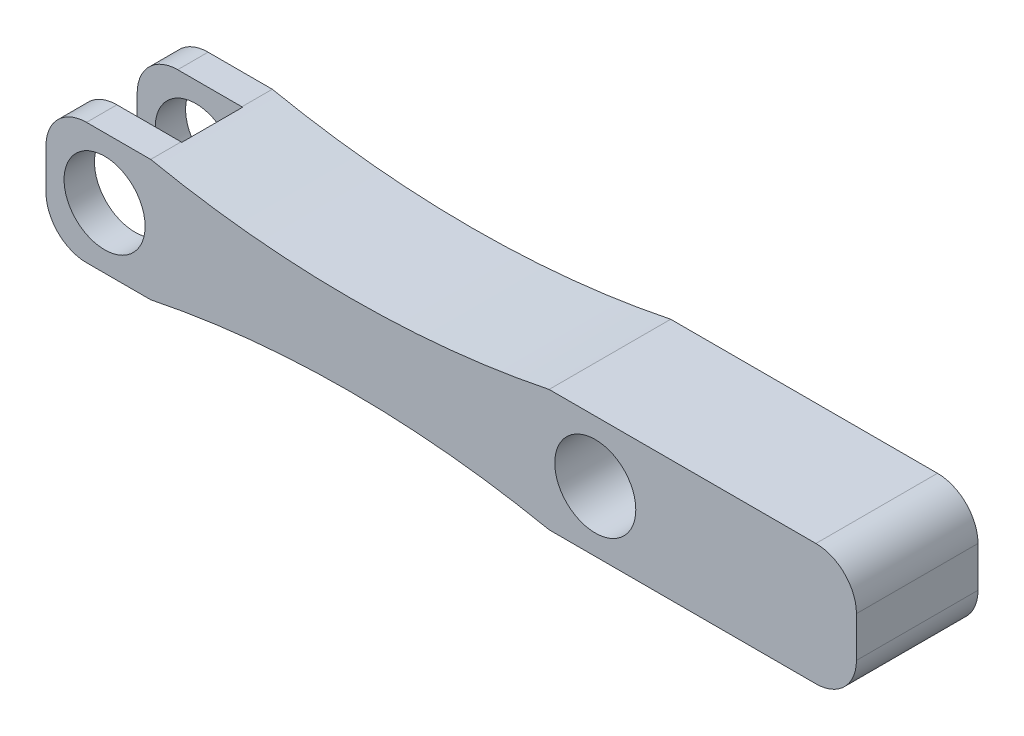
ISO-10303-21;
HEADER;
FILE_DESCRIPTION(('STEP AP214'),'2;1');
FILE_NAME('part.step','',(''),(''),'','','');
FILE_SCHEMA(('AUTOMOTIVE_DESIGN { 1 0 10303 214 1 1 1 1 }'));
ENDSEC;
DATA;
#1=APPLICATION_CONTEXT('core data for automotive mechanical design processes');
#2=APPLICATION_PROTOCOL_DEFINITION('international standard','automotive_design',2000,#1);
#3=PRODUCT_CONTEXT('',#1,'mechanical');
#4=PRODUCT('Part','Part','',(#3));
#5=PRODUCT_RELATED_PRODUCT_CATEGORY('part','',(#4));
#6=PRODUCT_DEFINITION_FORMATION('','',#4);
#7=PRODUCT_DEFINITION_CONTEXT('part definition',#1,'design');
#8=PRODUCT_DEFINITION('design','',#6,#7);
#9=PRODUCT_DEFINITION_SHAPE('','',#8);
#10=(LENGTH_UNIT() NAMED_UNIT(*) SI_UNIT(.MILLI.,.METRE.));
#11=(NAMED_UNIT(*) PLANE_ANGLE_UNIT() SI_UNIT($,.RADIAN.));
#12=(NAMED_UNIT(*) SI_UNIT($,.STERADIAN.) SOLID_ANGLE_UNIT());
#13=UNCERTAINTY_MEASURE_WITH_UNIT(LENGTH_MEASURE(1.E-05),#10,'distance_accuracy_value','');
#14=(GEOMETRIC_REPRESENTATION_CONTEXT(3) GLOBAL_UNCERTAINTY_ASSIGNED_CONTEXT((#13)) GLOBAL_UNIT_ASSIGNED_CONTEXT((#10,
#11,#12)) REPRESENTATION_CONTEXT('',''));
#15=CARTESIAN_POINT('',(0.,0.,0.));
#16=DIRECTION('',(0.,0.,1.));
#17=DIRECTION('',(1.,0.,0.));
#18=AXIS2_PLACEMENT_3D('',#15,#16,#17);
#19=CARTESIAN_POINT('',(-388.04781555799,-64.7963953765708,75.));
#20=DIRECTION('',(0.,1.,0.));
#21=DIRECTION('',(0.,0.,1.));
#22=AXIS2_PLACEMENT_3D('',#19,#20,#21);
#23=PLANE('',#22);
#24=DIRECTION('',(0.,0.,1.));
#25=VECTOR('',#24,1.);
#26=CARTESIAN_POINT('',(-284.691024879595,-64.7963953765708,-45.));
#27=LINE('',#26,#25);
#28=CARTESIAN_POINT('',(-284.691024879595,-64.7963953765708,-45.));
#29=VERTEX_POINT('',#28);
#30=CARTESIAN_POINT('',(-284.691024879595,-64.7963953765708,-15.));
#31=VERTEX_POINT('',#30);
#32=EDGE_CURVE('E62',#29,#31,#27,.T.);
#33=ORIENTED_EDGE('',*,*,#32,.T.);
#34=DIRECTION('',(-1.,0.,0.));
#35=VECTOR('',#34,1.);
#36=CARTESIAN_POINT('',(-284.04781555799,-64.7963953765708,-15.));
#37=LINE('',#36,#35);
#38=CARTESIAN_POINT('',(-348.04781555799,-64.7963953765708,-15.));
#39=VERTEX_POINT('',#38);
#40=EDGE_CURVE('E310',#31,#39,#37,.T.);
#41=ORIENTED_EDGE('',*,*,#40,.T.);
#42=DIRECTION('',(0.,0.,-1.));
#43=VECTOR('',#42,1.);
#44=CARTESIAN_POINT('',(-348.04781555799,-64.7963953765708,75.));
#45=LINE('',#44,#43);
#46=CARTESIAN_POINT('',(-348.04781555799,-64.7963953765708,-45.));
#47=VERTEX_POINT('',#46);
#48=EDGE_CURVE('E282',#39,#47,#45,.T.);
#49=ORIENTED_EDGE('',*,*,#48,.T.);
#50=DIRECTION('',(1.,0.,0.));
#51=VECTOR('',#50,1.);
#52=CARTESIAN_POINT('',(-388.04781555799,-64.7963953765708,-45.));
#53=LINE('',#52,#51);
#54=EDGE_CURVE('E238',#47,#29,#53,.T.);
#55=ORIENTED_EDGE('',*,*,#54,.T.);
#56=EDGE_LOOP('',(#33,#41,#49,#55));
#57=FACE_BOUND('',#56,.T.);
#58=ADVANCED_FACE('F37',(#57),#23,.F.);
#59=CARTESIAN_POINT('',(-388.04781555799,55.2036046234292,75.));
#60=DIRECTION('',(1.,0.,0.));
#61=DIRECTION('',(0.,0.,-1.));
#62=AXIS2_PLACEMENT_3D('',#59,#60,#61);
#63=PLANE('',#62);
#64=DIRECTION('',(0.,0.,-1.));
#65=VECTOR('',#64,1.);
#66=CARTESIAN_POINT('',(-388.04781555799,-24.7963953765707,75.));
#67=LINE('',#66,#65);
#68=CARTESIAN_POINT('',(-388.04781555799,-24.7963953765707,-45.));
#69=VERTEX_POINT('',#68);
#70=CARTESIAN_POINT('',(-388.04781555799,-24.7963953765707,-15.));
#71=VERTEX_POINT('',#70);
#72=EDGE_CURVE('E247',#69,#71,#67,.F.);
#73=ORIENTED_EDGE('',*,*,#72,.T.);
#74=DIRECTION('',(0.,-1.,0.));
#75=VECTOR('',#74,1.);
#76=CARTESIAN_POINT('',(-388.04781555799,55.2036046234292,-15.));
#77=LINE('',#76,#75);
#78=CARTESIAN_POINT('',(-388.04781555799,15.2036046234292,-15.));
#79=VERTEX_POINT('',#78);
#80=EDGE_CURVE('E311',#79,#71,#77,.T.);
#81=ORIENTED_EDGE('',*,*,#80,.F.);
#82=DIRECTION('',(0.,0.,-1.));
#83=VECTOR('',#82,1.);
#84=CARTESIAN_POINT('',(-388.04781555799,15.2036046234292,75.));
#85=LINE('',#84,#83);
#86=CARTESIAN_POINT('',(-388.04781555799,15.2036046234292,-45.));
#87=VERTEX_POINT('',#86);
#88=EDGE_CURVE('E250',#79,#87,#85,.T.);
#89=ORIENTED_EDGE('',*,*,#88,.T.);
#90=DIRECTION('',(0.,-1.,0.));
#91=VECTOR('',#90,1.);
#92=CARTESIAN_POINT('',(-388.04781555799,55.2036046234292,-45.));
#93=LINE('',#92,#91);
#94=EDGE_CURVE('E199',#87,#69,#93,.T.);
#95=ORIENTED_EDGE('',*,*,#94,.T.);
#96=EDGE_LOOP('',(#73,#81,#89,#95));
#97=FACE_BOUND('',#96,.T.);
#98=ADVANCED_FACE('F406',(#97),#63,.F.);
#99=CARTESIAN_POINT('',(-388.04781555799,55.2036046234292,75.));
#100=DIRECTION('',(0.,-1.,0.));
#101=DIRECTION('',(0.,0.,-1.));
#102=AXIS2_PLACEMENT_3D('',#99,#100,#101);
#103=PLANE('',#102);
#104=DIRECTION('',(0.,0.,-1.));
#105=VECTOR('',#104,1.);
#106=CARTESIAN_POINT('',(-348.04781555799,55.2036046234292,75.));
#107=LINE('',#106,#105);
#108=CARTESIAN_POINT('',(-348.04781555799,55.2036046234292,-45.));
#109=VERTEX_POINT('',#108);
#110=CARTESIAN_POINT('',(-348.04781555799,55.2036046234292,-15.));
#111=VERTEX_POINT('',#110);
#112=EDGE_CURVE('E268',#109,#111,#107,.F.);
#113=ORIENTED_EDGE('',*,*,#112,.T.);
#114=DIRECTION('',(-1.,0.,0.));
#115=VECTOR('',#114,1.);
#116=CARTESIAN_POINT('',(-284.04781555799,55.2036046234292,-15.));
#117=LINE('',#116,#115);
#118=CARTESIAN_POINT('',(-284.691024837989,55.2036046234292,-15.));
#119=VERTEX_POINT('',#118);
#120=EDGE_CURVE('E314',#119,#111,#117,.T.);
#121=ORIENTED_EDGE('',*,*,#120,.F.);
#122=DIRECTION('',(0.,0.,1.));
#123=VECTOR('',#122,1.);
#124=CARTESIAN_POINT('',(-284.69102483799,55.2036046234292,-45.));
#125=LINE('',#124,#123);
#126=CARTESIAN_POINT('',(-284.69102483799,55.2036046234292,-45.));
#127=VERTEX_POINT('',#126);
#128=EDGE_CURVE('E194',#127,#119,#125,.T.);
#129=ORIENTED_EDGE('',*,*,#128,.F.);
#130=DIRECTION('',(-1.,0.,0.));
#131=VECTOR('',#130,1.);
#132=CARTESIAN_POINT('',(-388.04781555799,55.2036046234292,-45.));
#133=LINE('',#132,#131);
#134=EDGE_CURVE('E244',#127,#109,#133,.T.);
#135=ORIENTED_EDGE('',*,*,#134,.T.);
#136=EDGE_LOOP('',(#113,#121,#129,#135));
#137=FACE_BOUND('',#136,.T.);
#138=ADVANCED_FACE('F395',(#137),#103,.F.);
#139=CARTESIAN_POINT('',(-348.04781555799,15.2036046234292,75.));
#140=DIRECTION('',(0.,0.,-1.));
#141=DIRECTION('',(-1.,0.,0.));
#142=AXIS2_PLACEMENT_3D('',#139,#140,#141);
#143=CYLINDRICAL_SURFACE('',#142,40.);
#144=CARTESIAN_POINT('',(-348.04781555799,15.2036046234292,-15.));
#145=DIRECTION('',(0.,0.,-1.));
#146=DIRECTION('',(-1.,0.,0.));
#147=AXIS2_PLACEMENT_3D('',#144,#145,#146);
#148=CIRCLE('',#147,40.);
#149=EDGE_CURVE('E218',#111,#79,#148,.F.);
#150=ORIENTED_EDGE('',*,*,#149,.F.);
#151=ORIENTED_EDGE('',*,*,#112,.F.);
#152=CARTESIAN_POINT('',(-348.04781555799,15.2036046234292,-45.));
#153=DIRECTION('',(0.,0.,1.));
#154=DIRECTION('',(1.,0.,0.));
#155=AXIS2_PLACEMENT_3D('',#152,#153,#154);
#156=CIRCLE('',#155,40.);
#157=EDGE_CURVE('E261',#87,#109,#156,.F.);
#158=ORIENTED_EDGE('',*,*,#157,.F.);
#159=ORIENTED_EDGE('',*,*,#88,.F.);
#160=EDGE_LOOP('',(#150,#151,#158,#159));
#161=FACE_BOUND('',#160,.T.);
#162=ADVANCED_FACE('F405',(#161),#143,.T.);
#163=CARTESIAN_POINT('',(-348.04781555799,-24.7963953765708,75.));
#164=DIRECTION('',(0.,0.,-1.));
#165=DIRECTION('',(-1.,0.,0.));
#166=AXIS2_PLACEMENT_3D('',#163,#164,#165);
#167=CYLINDRICAL_SURFACE('',#166,40.);
#168=CARTESIAN_POINT('',(-348.04781555799,-24.7963953765708,-15.));
#169=DIRECTION('',(0.,0.,-1.));
#170=DIRECTION('',(-1.,0.,0.));
#171=AXIS2_PLACEMENT_3D('',#168,#169,#170);
#172=CIRCLE('',#171,40.);
#173=EDGE_CURVE('E333',#71,#39,#172,.F.);
#174=ORIENTED_EDGE('',*,*,#173,.F.);
#175=ORIENTED_EDGE('',*,*,#72,.F.);
#176=CARTESIAN_POINT('',(-348.04781555799,-24.7963953765708,-45.));
#177=DIRECTION('',(0.,0.,1.));
#178=DIRECTION('',(1.,0.,0.));
#179=AXIS2_PLACEMENT_3D('',#176,#177,#178);
#180=CIRCLE('',#179,40.);
#181=EDGE_CURVE('E259',#47,#69,#180,.F.);
#182=ORIENTED_EDGE('',*,*,#181,.F.);
#183=ORIENTED_EDGE('',*,*,#48,.F.);
#184=EDGE_LOOP('',(#174,#175,#182,#183));
#185=FACE_BOUND('',#184,.T.);
#186=ADVANCED_FACE('F417',(#185),#167,.T.);
#187=CARTESIAN_POINT('',(-348.04781555799,-64.7963953765708,75.));
#188=VERTEX_POINT('',#187);
#189=CARTESIAN_POINT('',(-348.04781555799,-64.7963953765708,45.));
#190=VERTEX_POINT('',#189);
#191=EDGE_CURVE('E283',#188,#190,#45,.T.);
#192=ORIENTED_EDGE('',*,*,#191,.T.);
#193=DIRECTION('',(-1.,0.,0.));
#194=VECTOR('',#193,1.);
#195=CARTESIAN_POINT('',(-284.04781555799,-64.7963953765708,45.));
#196=LINE('',#195,#194);
#197=CARTESIAN_POINT('',(-284.691024879595,-64.7963953765708,45.));
#198=VERTEX_POINT('',#197);
#199=EDGE_CURVE('E320',#198,#190,#196,.T.);
#200=ORIENTED_EDGE('',*,*,#199,.F.);
#201=CARTESIAN_POINT('',(-284.691024879595,-64.7963953765708,75.));
#202=VERTEX_POINT('',#201);
#203=EDGE_CURVE('E214',#198,#202,#27,.T.);
#204=ORIENTED_EDGE('',*,*,#203,.T.);
#205=DIRECTION('',(1.,0.,0.));
#206=VECTOR('',#205,1.);
#207=CARTESIAN_POINT('',(-388.04781555799,-64.7963953765708,75.));
#208=LINE('',#207,#206);
#209=EDGE_CURVE('E227',#188,#202,#208,.T.);
#210=ORIENTED_EDGE('',*,*,#209,.F.);
#211=EDGE_LOOP('',(#192,#200,#204,#210));
#212=FACE_BOUND('',#211,.T.);
#213=ADVANCED_FACE('F373',(#212),#23,.F.);
#214=CARTESIAN_POINT('',(371.95218444201,55.2036046234292,-45.));
#215=VERTEX_POINT('',#214);
#216=CARTESIAN_POINT('',(108.595393763615,55.2036046234292,-45.));
#217=VERTEX_POINT('',#216);
#218=EDGE_CURVE('E226',#215,#217,#133,.T.);
#219=ORIENTED_EDGE('',*,*,#218,.T.);
#220=DIRECTION('',(0.,0.,1.));
#221=VECTOR('',#220,1.);
#222=CARTESIAN_POINT('',(108.595393763615,55.2036046234293,-45.));
#223=LINE('',#222,#221);
#224=CARTESIAN_POINT('',(108.595393763615,55.2036046234293,75.));
#225=VERTEX_POINT('',#224);
#226=EDGE_CURVE('E205',#217,#225,#223,.T.);
#227=ORIENTED_EDGE('',*,*,#226,.T.);
#228=DIRECTION('',(-1.,0.,0.));
#229=VECTOR('',#228,1.);
#230=CARTESIAN_POINT('',(-388.04781555799,55.2036046234292,75.));
#231=LINE('',#230,#229);
#232=CARTESIAN_POINT('',(371.95218444201,55.2036046234292,75.));
#233=VERTEX_POINT('',#232);
#234=EDGE_CURVE('E234',#233,#225,#231,.T.);
#235=ORIENTED_EDGE('',*,*,#234,.F.);
#236=DIRECTION('',(0.,0.,-1.));
#237=VECTOR('',#236,1.);
#238=CARTESIAN_POINT('',(371.95218444201,55.2036046234292,75.));
#239=LINE('',#238,#237);
#240=EDGE_CURVE('E264',#233,#215,#239,.T.);
#241=ORIENTED_EDGE('',*,*,#240,.T.);
#242=EDGE_LOOP('',(#219,#227,#235,#241));
#243=FACE_BOUND('',#242,.T.);
#244=ADVANCED_FACE('F344',(#243),#103,.F.);
#245=CARTESIAN_POINT('',(-388.04781555799,15.2036046234292,75.));
#246=VERTEX_POINT('',#245);
#247=CARTESIAN_POINT('',(-388.04781555799,15.2036046234292,45.));
#248=VERTEX_POINT('',#247);
#249=EDGE_CURVE('E251',#246,#248,#85,.T.);
#250=ORIENTED_EDGE('',*,*,#249,.T.);
#251=DIRECTION('',(0.,1.,0.));
#252=VECTOR('',#251,1.);
#253=CARTESIAN_POINT('',(-388.04781555799,55.2036046234292,45.));
#254=LINE('',#253,#252);
#255=CARTESIAN_POINT('',(-388.04781555799,-24.7963953765708,45.));
#256=VERTEX_POINT('',#255);
#257=EDGE_CURVE('E189',#256,#248,#254,.T.);
#258=ORIENTED_EDGE('',*,*,#257,.F.);
#259=CARTESIAN_POINT('',(-388.04781555799,-24.7963953765707,75.));
#260=VERTEX_POINT('',#259);
#261=EDGE_CURVE('E236',#256,#260,#67,.F.);
#262=ORIENTED_EDGE('',*,*,#261,.T.);
#263=DIRECTION('',(0.,-1.,0.));
#264=VECTOR('',#263,1.);
#265=CARTESIAN_POINT('',(-388.04781555799,55.2036046234292,75.));
#266=LINE('',#265,#264);
#267=EDGE_CURVE('E222',#246,#260,#266,.T.);
#268=ORIENTED_EDGE('',*,*,#267,.F.);
#269=EDGE_LOOP('',(#250,#258,#262,#268));
#270=FACE_BOUND('',#269,.T.);
#271=ADVANCED_FACE('F384',(#270),#63,.F.);
#272=CARTESIAN_POINT('',(108.595393763615,-64.7963953765708,75.));
#273=VERTEX_POINT('',#272);
#274=CARTESIAN_POINT('',(371.95218444201,-64.7963953765708,75.));
#275=VERTEX_POINT('',#274);
#276=EDGE_CURVE('E225',#273,#275,#208,.T.);
#277=ORIENTED_EDGE('',*,*,#276,.F.);
#278=DIRECTION('',(0.,0.,1.));
#279=VECTOR('',#278,1.);
#280=CARTESIAN_POINT('',(108.595393763615,-64.7963953765708,-45.));
#281=LINE('',#280,#279);
#282=CARTESIAN_POINT('',(108.595393763615,-64.7963953765708,-45.));
#283=VERTEX_POINT('',#282);
#284=EDGE_CURVE('E219',#283,#273,#281,.T.);
#285=ORIENTED_EDGE('',*,*,#284,.F.);
#286=CARTESIAN_POINT('',(371.95218444201,-64.7963953765708,-45.));
#287=VERTEX_POINT('',#286);
#288=EDGE_CURVE('E203',#283,#287,#53,.T.);
#289=ORIENTED_EDGE('',*,*,#288,.T.);
#290=DIRECTION('',(0.,0.,-1.));
#291=VECTOR('',#290,1.);
#292=CARTESIAN_POINT('',(371.95218444201,-64.7963953765708,75.));
#293=LINE('',#292,#291);
#294=EDGE_CURVE('E279',#287,#275,#293,.F.);
#295=ORIENTED_EDGE('',*,*,#294,.T.);
#296=EDGE_LOOP('',(#277,#285,#289,#295));
#297=FACE_BOUND('',#296,.T.);
#298=ADVANCED_FACE('F365',(#297),#23,.F.);
#299=CARTESIAN_POINT('',(411.95218444201,55.2036046234292,75.));
#300=DIRECTION('',(-1.,0.,0.));
#301=DIRECTION('',(0.,0.,1.));
#302=AXIS2_PLACEMENT_3D('',#299,#300,#301);
#303=PLANE('',#302);
#304=DIRECTION('',(0.,1.,0.));
#305=VECTOR('',#304,1.);
#306=CARTESIAN_POINT('',(411.95218444201,55.2036046234292,75.));
#307=LINE('',#306,#305);
#308=CARTESIAN_POINT('',(411.95218444201,-24.7963953765707,75.));
#309=VERTEX_POINT('',#308);
#310=CARTESIAN_POINT('',(411.95218444201,15.2036046234292,75.));
#311=VERTEX_POINT('',#310);
#312=EDGE_CURVE('E230',#309,#311,#307,.T.);
#313=ORIENTED_EDGE('',*,*,#312,.F.);
#314=DIRECTION('',(0.,0.,-1.));
#315=VECTOR('',#314,1.);
#316=CARTESIAN_POINT('',(411.95218444201,-24.7963953765707,75.));
#317=LINE('',#316,#315);
#318=CARTESIAN_POINT('',(411.95218444201,-24.7963953765707,-45.));
#319=VERTEX_POINT('',#318);
#320=EDGE_CURVE('E183',#309,#319,#317,.T.);
#321=ORIENTED_EDGE('',*,*,#320,.T.);
#322=DIRECTION('',(0.,1.,0.));
#323=VECTOR('',#322,1.);
#324=CARTESIAN_POINT('',(411.95218444201,55.2036046234292,-45.));
#325=LINE('',#324,#323);
#326=CARTESIAN_POINT('',(411.95218444201,15.2036046234292,-45.));
#327=VERTEX_POINT('',#326);
#328=EDGE_CURVE('E241',#319,#327,#325,.T.);
#329=ORIENTED_EDGE('',*,*,#328,.T.);
#330=DIRECTION('',(0.,0.,-1.));
#331=VECTOR('',#330,1.);
#332=CARTESIAN_POINT('',(411.95218444201,15.2036046234292,75.));
#333=LINE('',#332,#331);
#334=EDGE_CURVE('E286',#327,#311,#333,.F.);
#335=ORIENTED_EDGE('',*,*,#334,.T.);
#336=EDGE_LOOP('',(#313,#321,#329,#335));
#337=FACE_BOUND('',#336,.T.);
#338=ADVANCED_FACE('F354',(#337),#303,.F.);
#339=CARTESIAN_POINT('',(-284.691024837989,55.2036046234292,45.));
#340=VERTEX_POINT('',#339);
#341=CARTESIAN_POINT('',(-284.69102483799,55.2036046234292,75.));
#342=VERTEX_POINT('',#341);
#343=EDGE_CURVE('E200',#340,#342,#125,.T.);
#344=ORIENTED_EDGE('',*,*,#343,.F.);
#345=DIRECTION('',(-1.,0.,0.));
#346=VECTOR('',#345,1.);
#347=CARTESIAN_POINT('',(-284.04781555799,55.2036046234292,45.));
#348=LINE('',#347,#346);
#349=CARTESIAN_POINT('',(-348.04781555799,55.2036046234292,45.));
#350=VERTEX_POINT('',#349);
#351=EDGE_CURVE('E317',#340,#350,#348,.T.);
#352=ORIENTED_EDGE('',*,*,#351,.T.);
#353=CARTESIAN_POINT('',(-348.04781555799,55.2036046234292,75.));
#354=VERTEX_POINT('',#353);
#355=EDGE_CURVE('E267',#350,#354,#107,.F.);
#356=ORIENTED_EDGE('',*,*,#355,.T.);
#357=EDGE_CURVE('E233',#342,#354,#231,.T.);
#358=ORIENTED_EDGE('',*,*,#357,.F.);
#359=EDGE_LOOP('',(#344,#352,#356,#358));
#360=FACE_BOUND('',#359,.T.);
#361=ADVANCED_FACE('F392',(#360),#103,.F.);
#362=CARTESIAN_POINT('',(-173.086686782155,14.3918399175469,75.));
#363=DIRECTION('',(0.,0.,1.));
#364=DIRECTION('',(1.,0.,0.));
#365=AXIS2_PLACEMENT_3D('',#362,#363,#364);
#366=PLANE('',#365);
#367=CARTESIAN_POINT('',(-330.231586009599,-4.79639537657075,75.));
#368=DIRECTION('',(0.,0.,1.));
#369=DIRECTION('',(1.,0.,0.));
#370=AXIS2_PLACEMENT_3D('',#367,#368,#369);
#371=CIRCLE('',#370,40.);
#372=CARTESIAN_POINT('',(-290.231586009599,-4.79639537657075,75.));
#373=VERTEX_POINT('',#372);
#374=EDGE_CURVE('E293',#373,#373,#371,.T.);
#375=ORIENTED_EDGE('',*,*,#374,.F.);
#376=EDGE_LOOP('',(#375));
#377=FACE_BOUND('',#376,.T.);
#378=CARTESIAN_POINT('',(154.15218444201,-4.79639537657076,75.));
#379=DIRECTION('',(0.,0.,1.));
#380=DIRECTION('',(1.,0.,0.));
#381=AXIS2_PLACEMENT_3D('',#378,#379,#380);
#382=CIRCLE('',#381,40.);
#383=CARTESIAN_POINT('',(194.15218444201,-4.79639537657076,75.));
#384=VERTEX_POINT('',#383);
#385=EDGE_CURVE('E300',#384,#384,#382,.T.);
#386=ORIENTED_EDGE('',*,*,#385,.F.);
#387=EDGE_LOOP('',(#386));
#388=FACE_BOUND('',#387,.T.);
#389=CARTESIAN_POINT('',(-88.0478155371872,1011.91739893522,75.));
#390=DIRECTION('',(0.,0.,1.));
#391=DIRECTION('',(1.,0.,0.));
#392=AXIS2_PLACEMENT_3D('',#389,#390,#391);
#393=CIRCLE('',#392,976.713794307517);
#394=EDGE_CURVE('E208',#342,#225,#393,.T.);
#395=ORIENTED_EDGE('',*,*,#394,.F.);
#396=ORIENTED_EDGE('',*,*,#357,.T.);
#397=CARTESIAN_POINT('',(-348.04781555799,15.2036046234292,75.));
#398=DIRECTION('',(0.,0.,1.));
#399=DIRECTION('',(1.,0.,0.));
#400=AXIS2_PLACEMENT_3D('',#397,#398,#399);
#401=CIRCLE('',#400,40.);
#402=EDGE_CURVE('E277',#354,#246,#401,.T.);
#403=ORIENTED_EDGE('',*,*,#402,.T.);
#404=ORIENTED_EDGE('',*,*,#267,.T.);
#405=CARTESIAN_POINT('',(-348.04781555799,-24.7963953765708,75.));
#406=DIRECTION('',(0.,0.,1.));
#407=DIRECTION('',(1.,0.,0.));
#408=AXIS2_PLACEMENT_3D('',#405,#406,#407);
#409=CIRCLE('',#408,40.);
#410=EDGE_CURVE('E275',#260,#188,#409,.T.);
#411=ORIENTED_EDGE('',*,*,#410,.T.);
#412=ORIENTED_EDGE('',*,*,#209,.T.);
#413=CARTESIAN_POINT('',(-88.0478155579899,-1021.77327311613,75.));
#414=DIRECTION('',(0.,0.,1.));
#415=DIRECTION('',(-1.,0.,0.));
#416=AXIS2_PLACEMENT_3D('',#413,#414,#415);
#417=CIRCLE('',#416,976.97149206129);
#418=EDGE_CURVE('E215',#273,#202,#417,.T.);
#419=ORIENTED_EDGE('',*,*,#418,.F.);
#420=ORIENTED_EDGE('',*,*,#276,.T.);
#421=CARTESIAN_POINT('',(371.95218444201,-24.7963953765707,75.));
#422=DIRECTION('',(0.,0.,1.));
#423=DIRECTION('',(1.,0.,0.));
#424=AXIS2_PLACEMENT_3D('',#421,#422,#423);
#425=CIRCLE('',#424,40.);
#426=EDGE_CURVE('E273',#275,#309,#425,.T.);
#427=ORIENTED_EDGE('',*,*,#426,.T.);
#428=ORIENTED_EDGE('',*,*,#312,.T.);
#429=CARTESIAN_POINT('',(371.95218444201,15.2036046234292,75.));
#430=DIRECTION('',(0.,0.,1.));
#431=DIRECTION('',(1.,0.,0.));
#432=AXIS2_PLACEMENT_3D('',#429,#430,#431);
#433=CIRCLE('',#432,40.);
#434=EDGE_CURVE('E271',#311,#233,#433,.T.);
#435=ORIENTED_EDGE('',*,*,#434,.T.);
#436=ORIENTED_EDGE('',*,*,#234,.T.);
#437=EDGE_LOOP('',(#395,#396,#403,#404,#411,#412,#419,#420,#427,#428,#435,#436));
#438=FACE_BOUND('',#437,.T.);
#439=ADVANCED_FACE('F346',(#377,#388,#438),#366,.T.);
#440=CARTESIAN_POINT('',(-173.086686782155,14.3918399175469,-45.));
#441=DIRECTION('',(0.,0.,1.));
#442=DIRECTION('',(1.,0.,0.));
#443=AXIS2_PLACEMENT_3D('',#440,#441,#442);
#444=PLANE('',#443);
#445=CARTESIAN_POINT('',(-330.231586009599,-4.79639537657075,-45.));
#446=DIRECTION('',(0.,0.,1.));
#447=DIRECTION('',(1.,0.,0.));
#448=AXIS2_PLACEMENT_3D('',#445,#446,#447);
#449=CIRCLE('',#448,40.);
#450=CARTESIAN_POINT('',(-290.231586009599,-4.79639537657075,-45.));
#451=VERTEX_POINT('',#450);
#452=EDGE_CURVE('E297',#451,#451,#449,.T.);
#453=ORIENTED_EDGE('',*,*,#452,.T.);
#454=EDGE_LOOP('',(#453));
#455=FACE_BOUND('',#454,.T.);
#456=CARTESIAN_POINT('',(154.15218444201,-4.79639537657076,-45.));
#457=DIRECTION('',(0.,0.,1.));
#458=DIRECTION('',(1.,0.,0.));
#459=AXIS2_PLACEMENT_3D('',#456,#457,#458);
#460=CIRCLE('',#459,40.);
#461=CARTESIAN_POINT('',(194.15218444201,-4.79639537657076,-45.));
#462=VERTEX_POINT('',#461);
#463=EDGE_CURVE('E41',#462,#462,#460,.T.);
#464=ORIENTED_EDGE('',*,*,#463,.T.);
#465=EDGE_LOOP('',(#464));
#466=FACE_BOUND('',#465,.T.);
#467=ORIENTED_EDGE('',*,*,#134,.F.);
#468=CARTESIAN_POINT('',(-88.0478155371872,1011.91739893522,-45.));
#469=DIRECTION('',(0.,0.,1.));
#470=DIRECTION('',(1.,0.,0.));
#471=AXIS2_PLACEMENT_3D('',#468,#469,#470);
#472=CIRCLE('',#471,976.713794307517);
#473=EDGE_CURVE('E196',#127,#217,#472,.T.);
#474=ORIENTED_EDGE('',*,*,#473,.T.);
#475=ORIENTED_EDGE('',*,*,#218,.F.);
#476=CARTESIAN_POINT('',(371.95218444201,15.2036046234292,-45.));
#477=DIRECTION('',(0.,0.,1.));
#478=DIRECTION('',(1.,0.,0.));
#479=AXIS2_PLACEMENT_3D('',#476,#477,#478);
#480=CIRCLE('',#479,40.);
#481=EDGE_CURVE('E254',#215,#327,#480,.F.);
#482=ORIENTED_EDGE('',*,*,#481,.T.);
#483=ORIENTED_EDGE('',*,*,#328,.F.);
#484=CARTESIAN_POINT('',(371.95218444201,-24.7963953765707,-45.));
#485=DIRECTION('',(0.,0.,1.));
#486=DIRECTION('',(1.,0.,0.));
#487=AXIS2_PLACEMENT_3D('',#484,#485,#486);
#488=CIRCLE('',#487,40.);
#489=EDGE_CURVE('E256',#319,#287,#488,.F.);
#490=ORIENTED_EDGE('',*,*,#489,.T.);
#491=ORIENTED_EDGE('',*,*,#288,.F.);
#492=CARTESIAN_POINT('',(-88.0478155579899,-1021.77327311613,-45.));
#493=DIRECTION('',(0.,0.,1.));
#494=DIRECTION('',(-1.,0.,0.));
#495=AXIS2_PLACEMENT_3D('',#492,#493,#494);
#496=CIRCLE('',#495,976.97149206129);
#497=EDGE_CURVE('E212',#283,#29,#496,.T.);
#498=ORIENTED_EDGE('',*,*,#497,.T.);
#499=ORIENTED_EDGE('',*,*,#54,.F.);
#500=ORIENTED_EDGE('',*,*,#181,.T.);
#501=ORIENTED_EDGE('',*,*,#94,.F.);
#502=ORIENTED_EDGE('',*,*,#157,.T.);
#503=EDGE_LOOP('',(#467,#474,#475,#482,#483,#490,#491,#498,#499,#500,#501,#502));
#504=FACE_BOUND('',#503,.T.);
#505=ADVANCED_FACE('F351',(#455,#466,#504),#444,.F.);
#506=CARTESIAN_POINT('',(-348.04781555799,15.2036046234292,45.));
#507=DIRECTION('',(0.,0.,1.));
#508=DIRECTION('',(1.,0.,0.));
#509=AXIS2_PLACEMENT_3D('',#506,#507,#508);
#510=CIRCLE('',#509,40.);
#511=EDGE_CURVE('E330',#248,#350,#510,.F.);
#512=ORIENTED_EDGE('',*,*,#511,.F.);
#513=ORIENTED_EDGE('',*,*,#249,.F.);
#514=ORIENTED_EDGE('',*,*,#402,.F.);
#515=ORIENTED_EDGE('',*,*,#355,.F.);
#516=EDGE_LOOP('',(#512,#513,#514,#515));
#517=FACE_BOUND('',#516,.T.);
#518=ADVANCED_FACE('F389',(#517),#143,.T.);
#519=CARTESIAN_POINT('',(-348.04781555799,-24.7963953765708,45.));
#520=DIRECTION('',(0.,0.,1.));
#521=DIRECTION('',(1.,0.,0.));
#522=AXIS2_PLACEMENT_3D('',#519,#520,#521);
#523=CIRCLE('',#522,40.);
#524=EDGE_CURVE('E328',#190,#256,#523,.F.);
#525=ORIENTED_EDGE('',*,*,#524,.F.);
#526=ORIENTED_EDGE('',*,*,#191,.F.);
#527=ORIENTED_EDGE('',*,*,#410,.F.);
#528=ORIENTED_EDGE('',*,*,#261,.F.);
#529=EDGE_LOOP('',(#525,#526,#527,#528));
#530=FACE_BOUND('',#529,.T.);
#531=ADVANCED_FACE('F377',(#530),#167,.T.);
#532=CARTESIAN_POINT('',(371.95218444201,-24.7963953765707,75.));
#533=DIRECTION('',(0.,0.,-1.));
#534=DIRECTION('',(-1.,0.,0.));
#535=AXIS2_PLACEMENT_3D('',#532,#533,#534);
#536=CYLINDRICAL_SURFACE('',#535,40.);
#537=ORIENTED_EDGE('',*,*,#426,.F.);
#538=ORIENTED_EDGE('',*,*,#294,.F.);
#539=ORIENTED_EDGE('',*,*,#489,.F.);
#540=ORIENTED_EDGE('',*,*,#320,.F.);
#541=EDGE_LOOP('',(#537,#538,#539,#540));
#542=FACE_BOUND('',#541,.T.);
#543=ADVANCED_FACE('F358',(#542),#536,.T.);
#544=CARTESIAN_POINT('',(371.95218444201,15.2036046234292,75.));
#545=DIRECTION('',(0.,0.,-1.));
#546=DIRECTION('',(-1.,0.,0.));
#547=AXIS2_PLACEMENT_3D('',#544,#545,#546);
#548=CYLINDRICAL_SURFACE('',#547,40.);
#549=ORIENTED_EDGE('',*,*,#434,.F.);
#550=ORIENTED_EDGE('',*,*,#334,.F.);
#551=ORIENTED_EDGE('',*,*,#481,.F.);
#552=ORIENTED_EDGE('',*,*,#240,.F.);
#553=EDGE_LOOP('',(#549,#550,#551,#552));
#554=FACE_BOUND('',#553,.T.);
#555=ADVANCED_FACE('F39',(#554),#548,.T.);
#556=CARTESIAN_POINT('',(-88.0478155579899,-1021.77327311613,-45.));
#557=DIRECTION('',(0.,0.,1.));
#558=DIRECTION('',(1.,0.,0.));
#559=AXIS2_PLACEMENT_3D('',#556,#557,#558);
#560=CYLINDRICAL_SURFACE('',#559,976.97149206129);
#561=DIRECTION('',(0.,0.,1.));
#562=VECTOR('',#561,1.);
#563=CARTESIAN_POINT('',(-284.04781555799,-64.6644515600563,-45.));
#564=LINE('',#563,#562);
#565=CARTESIAN_POINT('',(-284.04781555799,-64.6644515600563,-15.));
#566=VERTEX_POINT('',#565);
#567=CARTESIAN_POINT('',(-284.04781555799,-64.6644515600563,45.));
#568=VERTEX_POINT('',#567);
#569=EDGE_CURVE('E316',#566,#568,#564,.T.);
#570=ORIENTED_EDGE('',*,*,#569,.F.);
#571=CARTESIAN_POINT('',(-88.0478155579899,-1021.77327311613,-15.));
#572=DIRECTION('',(0.,0.,-1.));
#573=DIRECTION('',(-1.,0.,0.));
#574=AXIS2_PLACEMENT_3D('',#571,#572,#573);
#575=CIRCLE('',#574,976.97149206129);
#576=EDGE_CURVE('E188',#566,#31,#575,.F.);
#577=ORIENTED_EDGE('',*,*,#576,.T.);
#578=ORIENTED_EDGE('',*,*,#32,.F.);
#579=ORIENTED_EDGE('',*,*,#497,.F.);
#580=ORIENTED_EDGE('',*,*,#284,.T.);
#581=ORIENTED_EDGE('',*,*,#418,.T.);
#582=ORIENTED_EDGE('',*,*,#203,.F.);
#583=CARTESIAN_POINT('',(-88.0478155579899,-1021.77327311613,45.));
#584=DIRECTION('',(0.,0.,1.));
#585=DIRECTION('',(1.,0.,0.));
#586=AXIS2_PLACEMENT_3D('',#583,#584,#585);
#587=CIRCLE('',#586,976.97149206129);
#588=EDGE_CURVE('E325',#198,#568,#587,.F.);
#589=ORIENTED_EDGE('',*,*,#588,.T.);
#590=EDGE_LOOP('',(#570,#577,#578,#579,#580,#581,#582,#589));
#591=FACE_BOUND('',#590,.T.);
#592=ADVANCED_FACE('F367',(#591),#560,.F.);
#593=CARTESIAN_POINT('',(-88.0478155371872,1011.91739893522,-45.));
#594=DIRECTION('',(0.,0.,1.));
#595=DIRECTION('',(1.,0.,0.));
#596=AXIS2_PLACEMENT_3D('',#593,#594,#595);
#597=CYLINDRICAL_SURFACE('',#596,976.713794307517);
#598=ORIENTED_EDGE('',*,*,#128,.T.);
#599=CARTESIAN_POINT('',(-88.0478155371872,1011.91739893522,-15.));
#600=DIRECTION('',(0.,0.,-1.));
#601=DIRECTION('',(-1.,0.,0.));
#602=AXIS2_PLACEMENT_3D('',#599,#600,#601);
#603=CIRCLE('',#602,976.713794307517);
#604=CARTESIAN_POINT('',(-284.04781555799,55.07162453768,-15.));
#605=VERTEX_POINT('',#604);
#606=EDGE_CURVE('E11',#119,#605,#603,.F.);
#607=ORIENTED_EDGE('',*,*,#606,.T.);
#608=DIRECTION('',(0.,0.,1.));
#609=VECTOR('',#608,1.);
#610=CARTESIAN_POINT('',(-284.04781555799,55.07162453768,-45.));
#611=LINE('',#610,#609);
#612=CARTESIAN_POINT('',(-284.04781555799,55.07162453768,45.));
#613=VERTEX_POINT('',#612);
#614=EDGE_CURVE('E176',#613,#605,#611,.F.);
#615=ORIENTED_EDGE('',*,*,#614,.F.);
#616=CARTESIAN_POINT('',(-88.0478155371872,1011.91739893522,45.));
#617=DIRECTION('',(0.,0.,1.));
#618=DIRECTION('',(1.,0.,0.));
#619=AXIS2_PLACEMENT_3D('',#616,#617,#618);
#620=CIRCLE('',#619,976.713794307517);
#621=EDGE_CURVE('E46',#613,#340,#620,.F.);
#622=ORIENTED_EDGE('',*,*,#621,.T.);
#623=ORIENTED_EDGE('',*,*,#343,.T.);
#624=ORIENTED_EDGE('',*,*,#394,.T.);
#625=ORIENTED_EDGE('',*,*,#226,.F.);
#626=ORIENTED_EDGE('',*,*,#473,.F.);
#627=EDGE_LOOP('',(#598,#607,#615,#622,#623,#624,#625,#626));
#628=FACE_BOUND('',#627,.T.);
#629=ADVANCED_FACE('F192',(#628),#597,.F.);
#630=CARTESIAN_POINT('',(-284.04781555799,55.2036046234292,-15.));
#631=DIRECTION('',(0.,0.,-1.));
#632=DIRECTION('',(-1.,0.,0.));
#633=AXIS2_PLACEMENT_3D('',#630,#631,#632);
#634=PLANE('',#633);
#635=CARTESIAN_POINT('',(-330.231586009599,-4.79639537657075,-15.));
#636=DIRECTION('',(0.,0.,-1.));
#637=DIRECTION('',(-1.,0.,0.));
#638=AXIS2_PLACEMENT_3D('',#635,#636,#637);
#639=CIRCLE('',#638,40.);
#640=CARTESIAN_POINT('',(-290.231586009599,-4.79639537657075,-15.));
#641=VERTEX_POINT('',#640);
#642=EDGE_CURVE('E292',#641,#641,#639,.T.);
#643=ORIENTED_EDGE('',*,*,#642,.T.);
#644=EDGE_LOOP('',(#643));
#645=FACE_BOUND('',#644,.T.);
#646=ORIENTED_EDGE('',*,*,#149,.T.);
#647=ORIENTED_EDGE('',*,*,#80,.T.);
#648=ORIENTED_EDGE('',*,*,#173,.T.);
#649=ORIENTED_EDGE('',*,*,#40,.F.);
#650=ORIENTED_EDGE('',*,*,#576,.F.);
#651=DIRECTION('',(0.,-1.,0.));
#652=VECTOR('',#651,1.);
#653=CARTESIAN_POINT('',(-284.04781555799,55.2036046234292,-15.));
#654=LINE('',#653,#652);
#655=EDGE_CURVE('E179',#605,#566,#654,.T.);
#656=ORIENTED_EDGE('',*,*,#655,.F.);
#657=ORIENTED_EDGE('',*,*,#606,.F.);
#658=ORIENTED_EDGE('',*,*,#120,.T.);
#659=EDGE_LOOP('',(#646,#647,#648,#649,#650,#656,#657,#658));
#660=FACE_BOUND('',#659,.T.);
#661=ADVANCED_FACE('F186',(#645,#660),#634,.F.);
#662=CARTESIAN_POINT('',(-284.04781555799,55.2036046234292,45.));
#663=DIRECTION('',(0.,0.,1.));
#664=DIRECTION('',(1.,0.,0.));
#665=AXIS2_PLACEMENT_3D('',#662,#663,#664);
#666=PLANE('',#665);
#667=CARTESIAN_POINT('',(-330.231586009599,-4.79639537657075,45.));
#668=DIRECTION('',(0.,0.,1.));
#669=DIRECTION('',(1.,0.,0.));
#670=AXIS2_PLACEMENT_3D('',#667,#668,#669);
#671=CIRCLE('',#670,40.);
#672=CARTESIAN_POINT('',(-290.231586009599,-4.79639537657075,45.));
#673=VERTEX_POINT('',#672);
#674=EDGE_CURVE('E290',#673,#673,#671,.T.);
#675=ORIENTED_EDGE('',*,*,#674,.T.);
#676=EDGE_LOOP('',(#675));
#677=FACE_BOUND('',#676,.T.);
#678=ORIENTED_EDGE('',*,*,#511,.T.);
#679=ORIENTED_EDGE('',*,*,#351,.F.);
#680=ORIENTED_EDGE('',*,*,#621,.F.);
#681=DIRECTION('',(0.,1.,0.));
#682=VECTOR('',#681,1.);
#683=CARTESIAN_POINT('',(-284.04781555799,55.2036046234292,45.));
#684=LINE('',#683,#682);
#685=EDGE_CURVE('E54',#568,#613,#684,.T.);
#686=ORIENTED_EDGE('',*,*,#685,.F.);
#687=ORIENTED_EDGE('',*,*,#588,.F.);
#688=ORIENTED_EDGE('',*,*,#199,.T.);
#689=ORIENTED_EDGE('',*,*,#524,.T.);
#690=ORIENTED_EDGE('',*,*,#257,.T.);
#691=EDGE_LOOP('',(#678,#679,#680,#686,#687,#688,#689,#690));
#692=FACE_BOUND('',#691,.T.);
#693=ADVANCED_FACE('F381',(#677,#692),#666,.F.);
#694=CARTESIAN_POINT('',(-284.04781555799,14.3918399175469,-45.));
#695=DIRECTION('',(-1.,0.,0.));
#696=DIRECTION('',(0.,0.,1.));
#697=AXIS2_PLACEMENT_3D('',#694,#695,#696);
#698=PLANE('',#697);
#699=ORIENTED_EDGE('',*,*,#569,.T.);
#700=ORIENTED_EDGE('',*,*,#685,.T.);
#701=ORIENTED_EDGE('',*,*,#614,.T.);
#702=ORIENTED_EDGE('',*,*,#655,.T.);
#703=EDGE_LOOP('',(#699,#700,#701,#702));
#704=FACE_BOUND('',#703,.T.);
#705=ADVANCED_FACE('F178',(#704),#698,.T.);
#706=CARTESIAN_POINT('',(-330.231586009599,-4.79639537657075,-105.));
#707=DIRECTION('',(0.,0.,1.));
#708=DIRECTION('',(1.,0.,0.));
#709=AXIS2_PLACEMENT_3D('',#706,#707,#708);
#710=CYLINDRICAL_SURFACE('',#709,40.);
#711=CARTESIAN_POINT('',(-290.231586009599,-4.79639537657075,75.));
#712=CARTESIAN_POINT('',(-290.231586009599,-4.79639537657075,74.6875));
#713=CARTESIAN_POINT('',(-290.231586009599,-4.79639537657075,74.375));
#714=CARTESIAN_POINT('',(-290.231586009599,-4.79639537657075,73.75));
#715=CARTESIAN_POINT('',(-290.231586009599,-4.79639537657075,73.4375));
#716=CARTESIAN_POINT('',(-290.231586009599,-4.79639537657075,72.8125));
#717=CARTESIAN_POINT('',(-290.231586009599,-4.79639537657075,72.5));
#718=CARTESIAN_POINT('',(-290.231586009599,-4.79639537657075,71.875));
#719=CARTESIAN_POINT('',(-290.231586009599,-4.79639537657075,71.5625));
#720=CARTESIAN_POINT('',(-290.231586009599,-4.79639537657075,70.9375));
#721=CARTESIAN_POINT('',(-290.231586009599,-4.79639537657075,70.625));
#722=CARTESIAN_POINT('',(-290.231586009599,-4.79639537657075,70.));
#723=CARTESIAN_POINT('',(-290.231586009599,-4.79639537657075,69.6875));
#724=CARTESIAN_POINT('',(-290.231586009599,-4.79639537657075,69.0625));
#725=CARTESIAN_POINT('',(-290.231586009599,-4.79639537657075,68.75));
#726=CARTESIAN_POINT('',(-290.231586009599,-4.79639537657075,68.125));
#727=CARTESIAN_POINT('',(-290.231586009599,-4.79639537657075,67.8125));
#728=CARTESIAN_POINT('',(-290.231586009599,-4.79639537657075,67.1875));
#729=CARTESIAN_POINT('',(-290.231586009599,-4.79639537657075,66.875));
#730=CARTESIAN_POINT('',(-290.231586009599,-4.79639537657075,66.25));
#731=CARTESIAN_POINT('',(-290.231586009599,-4.79639537657075,65.9375));
#732=CARTESIAN_POINT('',(-290.231586009599,-4.79639537657075,65.3125));
#733=CARTESIAN_POINT('',(-290.231586009599,-4.79639537657075,65.));
#734=CARTESIAN_POINT('',(-290.231586009599,-4.79639537657075,64.375));
#735=CARTESIAN_POINT('',(-290.231586009599,-4.79639537657075,64.0625));
#736=CARTESIAN_POINT('',(-290.231586009599,-4.79639537657075,63.4375));
#737=CARTESIAN_POINT('',(-290.231586009599,-4.79639537657075,63.125));
#738=CARTESIAN_POINT('',(-290.231586009599,-4.79639537657075,62.5));
#739=CARTESIAN_POINT('',(-290.231586009599,-4.79639537657075,62.1875));
#740=CARTESIAN_POINT('',(-290.231586009599,-4.79639537657075,61.5625));
#741=CARTESIAN_POINT('',(-290.231586009599,-4.79639537657075,61.25));
#742=CARTESIAN_POINT('',(-290.231586009599,-4.79639537657075,60.625));
#743=CARTESIAN_POINT('',(-290.231586009599,-4.79639537657075,60.3125));
#744=CARTESIAN_POINT('',(-290.231586009599,-4.79639537657075,59.6875));
#745=CARTESIAN_POINT('',(-290.231586009599,-4.79639537657075,59.375));
#746=CARTESIAN_POINT('',(-290.231586009599,-4.79639537657075,58.75));
#747=CARTESIAN_POINT('',(-290.231586009599,-4.79639537657075,58.4375));
#748=CARTESIAN_POINT('',(-290.231586009599,-4.79639537657075,57.8125));
#749=CARTESIAN_POINT('',(-290.231586009599,-4.79639537657075,57.5));
#750=CARTESIAN_POINT('',(-290.231586009599,-4.79639537657075,56.875));
#751=CARTESIAN_POINT('',(-290.231586009599,-4.79639537657075,56.5625));
#752=CARTESIAN_POINT('',(-290.231586009599,-4.79639537657075,55.9375));
#753=CARTESIAN_POINT('',(-290.231586009599,-4.79639537657075,55.625));
#754=CARTESIAN_POINT('',(-290.231586009599,-4.79639537657075,55.));
#755=CARTESIAN_POINT('',(-290.231586009599,-4.79639537657075,54.6875));
#756=CARTESIAN_POINT('',(-290.231586009599,-4.79639537657075,54.0625));
#757=CARTESIAN_POINT('',(-290.231586009599,-4.79639537657075,53.75));
#758=CARTESIAN_POINT('',(-290.231586009599,-4.79639537657075,53.125));
#759=CARTESIAN_POINT('',(-290.231586009599,-4.79639537657075,52.8125));
#760=CARTESIAN_POINT('',(-290.231586009599,-4.79639537657075,52.1875));
#761=CARTESIAN_POINT('',(-290.231586009599,-4.79639537657075,51.875));
#762=CARTESIAN_POINT('',(-290.231586009599,-4.79639537657075,51.25));
#763=CARTESIAN_POINT('',(-290.231586009599,-4.79639537657075,50.9375));
#764=CARTESIAN_POINT('',(-290.231586009599,-4.79639537657075,50.3125));
#765=CARTESIAN_POINT('',(-290.231586009599,-4.79639537657075,50.));
#766=CARTESIAN_POINT('',(-290.231586009599,-4.79639537657075,49.375));
#767=CARTESIAN_POINT('',(-290.231586009599,-4.79639537657075,49.0625));
#768=CARTESIAN_POINT('',(-290.231586009599,-4.79639537657075,48.4375));
#769=CARTESIAN_POINT('',(-290.231586009599,-4.79639537657075,48.125));
#770=CARTESIAN_POINT('',(-290.231586009599,-4.79639537657075,47.5));
#771=CARTESIAN_POINT('',(-290.231586009599,-4.79639537657075,47.1875));
#772=CARTESIAN_POINT('',(-290.231586009599,-4.79639537657075,46.5625));
#773=CARTESIAN_POINT('',(-290.231586009599,-4.79639537657075,46.25));
#774=CARTESIAN_POINT('',(-290.231586009599,-4.79639537657075,45.625));
#775=CARTESIAN_POINT('',(-290.231586009599,-4.79639537657075,45.3125));
#776=CARTESIAN_POINT('',(-290.231586009599,-4.79639537657075,45.));
#777=B_SPLINE_CURVE_WITH_KNOTS('',3,(#711,#712,#713,#714,#715,#716,#717,#718,#719,#720,#721,
#722,#723,#724,#725,#726,#727,#728,#729,#730,#731,#732,#733,#734,#735,#736,#737,#738,#739,#740,
#741,#742,#743,#744,#745,#746,#747,#748,#749,#750,#751,#752,#753,#754,#755,#756,#757,#758,#759,
#760,#761,#762,#763,#764,#765,#766,#767,#768,#769,#770,#771,#772,#773,#774,#775,#776),
.UNSPECIFIED.,.F.,.F.,(4,2,2,2,2,2,2,2,2,2,2,2,2,2,2,2,2,2,2,2,2,2,2,2,2,2,2,2,2,2,2,2,4),(0.,
0.937500000000008,1.87500000000002,2.8125,3.75,4.68750000000001,5.62499999999999,6.5625,
7.50000000000001,8.43750000000001,9.37500000000002,10.3125,11.25,12.1875,13.125,14.0625,15.,
15.9375,16.875,17.8125,18.75,19.6875,20.625,21.5625,22.5,23.4375,24.375,25.3125,26.25,27.1875,
28.125,29.0625,30.),.UNSPECIFIED.);
#778=EDGE_CURVE('BSEAM458',#373,#673,#777,.T.);
#779=ORIENTED_EDGE('',*,*,#374,.T.);
#780=ORIENTED_EDGE('',*,*,#674,.F.);
#781=ORIENTED_EDGE('',*,*,#778,.T.);
#782=ORIENTED_EDGE('',*,*,#778,.F.);
#783=EDGE_LOOP('',(#779,#781,#780,#782));
#784=FACE_BOUND('',#783,.T.);
#785=ADVANCED_FACE('F458',(#784),#710,.F.);
#786=CARTESIAN_POINT('',(-290.231586009599,-4.79639537657075,-15.));
#787=CARTESIAN_POINT('',(-290.231586009599,-4.79639537657075,-15.3125));
#788=CARTESIAN_POINT('',(-290.231586009599,-4.79639537657075,-15.625));
#789=CARTESIAN_POINT('',(-290.231586009599,-4.79639537657075,-16.25));
#790=CARTESIAN_POINT('',(-290.231586009599,-4.79639537657075,-16.5625));
#791=CARTESIAN_POINT('',(-290.231586009599,-4.79639537657075,-17.1875));
#792=CARTESIAN_POINT('',(-290.231586009599,-4.79639537657075,-17.5));
#793=CARTESIAN_POINT('',(-290.231586009599,-4.79639537657075,-18.125));
#794=CARTESIAN_POINT('',(-290.231586009599,-4.79639537657075,-18.4375));
#795=CARTESIAN_POINT('',(-290.231586009599,-4.79639537657075,-19.0625));
#796=CARTESIAN_POINT('',(-290.231586009599,-4.79639537657075,-19.375));
#797=CARTESIAN_POINT('',(-290.231586009599,-4.79639537657075,-20.));
#798=CARTESIAN_POINT('',(-290.231586009599,-4.79639537657075,-20.3125));
#799=CARTESIAN_POINT('',(-290.231586009599,-4.79639537657075,-20.9375));
#800=CARTESIAN_POINT('',(-290.231586009599,-4.79639537657075,-21.25));
#801=CARTESIAN_POINT('',(-290.231586009599,-4.79639537657075,-21.875));
#802=CARTESIAN_POINT('',(-290.231586009599,-4.79639537657075,-22.1875));
#803=CARTESIAN_POINT('',(-290.231586009599,-4.79639537657075,-22.8125));
#804=CARTESIAN_POINT('',(-290.231586009599,-4.79639537657075,-23.125));
#805=CARTESIAN_POINT('',(-290.231586009599,-4.79639537657075,-23.75));
#806=CARTESIAN_POINT('',(-290.231586009599,-4.79639537657075,-24.0625));
#807=CARTESIAN_POINT('',(-290.231586009599,-4.79639537657075,-24.6875));
#808=CARTESIAN_POINT('',(-290.231586009599,-4.79639537657075,-25.));
#809=CARTESIAN_POINT('',(-290.231586009599,-4.79639537657075,-25.625));
#810=CARTESIAN_POINT('',(-290.231586009599,-4.79639537657075,-25.9375));
#811=CARTESIAN_POINT('',(-290.231586009599,-4.79639537657075,-26.5625));
#812=CARTESIAN_POINT('',(-290.231586009599,-4.79639537657075,-26.875));
#813=CARTESIAN_POINT('',(-290.231586009599,-4.79639537657075,-27.5));
#814=CARTESIAN_POINT('',(-290.231586009599,-4.79639537657075,-27.8125));
#815=CARTESIAN_POINT('',(-290.231586009599,-4.79639537657075,-28.4375));
#816=CARTESIAN_POINT('',(-290.231586009599,-4.79639537657075,-28.75));
#817=CARTESIAN_POINT('',(-290.231586009599,-4.79639537657075,-29.375));
#818=CARTESIAN_POINT('',(-290.231586009599,-4.79639537657075,-29.6875));
#819=CARTESIAN_POINT('',(-290.231586009599,-4.79639537657075,-30.3125));
#820=CARTESIAN_POINT('',(-290.231586009599,-4.79639537657075,-30.625));
#821=CARTESIAN_POINT('',(-290.231586009599,-4.79639537657075,-31.25));
#822=CARTESIAN_POINT('',(-290.231586009599,-4.79639537657075,-31.5625));
#823=CARTESIAN_POINT('',(-290.231586009599,-4.79639537657075,-32.1875));
#824=CARTESIAN_POINT('',(-290.231586009599,-4.79639537657075,-32.5));
#825=CARTESIAN_POINT('',(-290.231586009599,-4.79639537657075,-33.125));
#826=CARTESIAN_POINT('',(-290.231586009599,-4.79639537657075,-33.4375));
#827=CARTESIAN_POINT('',(-290.231586009599,-4.79639537657075,-34.0625));
#828=CARTESIAN_POINT('',(-290.231586009599,-4.79639537657075,-34.375));
#829=CARTESIAN_POINT('',(-290.231586009599,-4.79639537657075,-35.));
#830=CARTESIAN_POINT('',(-290.231586009599,-4.79639537657075,-35.3125));
#831=CARTESIAN_POINT('',(-290.231586009599,-4.79639537657075,-35.9375));
#832=CARTESIAN_POINT('',(-290.231586009599,-4.79639537657075,-36.25));
#833=CARTESIAN_POINT('',(-290.231586009599,-4.79639537657075,-36.875));
#834=CARTESIAN_POINT('',(-290.231586009599,-4.79639537657075,-37.1875));
#835=CARTESIAN_POINT('',(-290.231586009599,-4.79639537657075,-37.8125));
#836=CARTESIAN_POINT('',(-290.231586009599,-4.79639537657075,-38.125));
#837=CARTESIAN_POINT('',(-290.231586009599,-4.79639537657075,-38.75));
#838=CARTESIAN_POINT('',(-290.231586009599,-4.79639537657075,-39.0625));
#839=CARTESIAN_POINT('',(-290.231586009599,-4.79639537657075,-39.6875));
#840=CARTESIAN_POINT('',(-290.231586009599,-4.79639537657075,-40.));
#841=CARTESIAN_POINT('',(-290.231586009599,-4.79639537657075,-40.625));
#842=CARTESIAN_POINT('',(-290.231586009599,-4.79639537657075,-40.9375));
#843=CARTESIAN_POINT('',(-290.231586009599,-4.79639537657075,-41.5625));
#844=CARTESIAN_POINT('',(-290.231586009599,-4.79639537657075,-41.875));
#845=CARTESIAN_POINT('',(-290.231586009599,-4.79639537657075,-42.5));
#846=CARTESIAN_POINT('',(-290.231586009599,-4.79639537657075,-42.8125));
#847=CARTESIAN_POINT('',(-290.231586009599,-4.79639537657075,-43.4375));
#848=CARTESIAN_POINT('',(-290.231586009599,-4.79639537657075,-43.75));
#849=CARTESIAN_POINT('',(-290.231586009599,-4.79639537657075,-44.375));
#850=CARTESIAN_POINT('',(-290.231586009599,-4.79639537657075,-44.6875));
#851=CARTESIAN_POINT('',(-290.231586009599,-4.79639537657075,-45.));
#852=B_SPLINE_CURVE_WITH_KNOTS('',3,(#786,#787,#788,#789,#790,#791,#792,#793,#794,#795,#796,
#797,#798,#799,#800,#801,#802,#803,#804,#805,#806,#807,#808,#809,#810,#811,#812,#813,#814,#815,
#816,#817,#818,#819,#820,#821,#822,#823,#824,#825,#826,#827,#828,#829,#830,#831,#832,#833,#834,
#835,#836,#837,#838,#839,#840,#841,#842,#843,#844,#845,#846,#847,#848,#849,#850,#851),
.UNSPECIFIED.,.F.,.F.,(4,2,2,2,2,2,2,2,2,2,2,2,2,2,2,2,2,2,2,2,2,2,2,2,2,2,2,2,2,2,2,2,4),(0.,
0.937500000000008,1.875,2.8125,3.75,4.68750000000001,5.62500000000001,6.5625,7.50000000000001,
8.43750000000001,9.37500000000001,10.3125,11.25,12.1875,13.125,14.0625,15.,15.9375,16.875,
17.8125,18.75,19.6875,20.625,21.5625,22.5,23.4375,24.375,25.3125,26.25,27.1875,28.125,29.0625,
30.),.UNSPECIFIED.);
#853=EDGE_CURVE('BSEAM452',#641,#451,#852,.T.);
#854=ORIENTED_EDGE('',*,*,#642,.F.);
#855=ORIENTED_EDGE('',*,*,#452,.F.);
#856=ORIENTED_EDGE('',*,*,#853,.T.);
#857=ORIENTED_EDGE('',*,*,#853,.F.);
#858=EDGE_LOOP('',(#854,#856,#855,#857));
#859=FACE_BOUND('',#858,.T.);
#860=ADVANCED_FACE('F452',(#859),#710,.F.);
#861=CARTESIAN_POINT('',(154.15218444201,-4.79639537657076,-105.));
#862=DIRECTION('',(0.,0.,1.));
#863=DIRECTION('',(1.,0.,0.));
#864=AXIS2_PLACEMENT_3D('',#861,#862,#863);
#865=CYLINDRICAL_SURFACE('',#864,40.);
#866=CARTESIAN_POINT('',(194.15218444201,-4.79639537657076,75.));
#867=CARTESIAN_POINT('',(194.15218444201,-4.79639537657076,73.75));
#868=CARTESIAN_POINT('',(194.15218444201,-4.79639537657076,72.5));
#869=CARTESIAN_POINT('',(194.15218444201,-4.79639537657076,70.));
#870=CARTESIAN_POINT('',(194.15218444201,-4.79639537657076,68.75));
#871=CARTESIAN_POINT('',(194.15218444201,-4.79639537657076,66.25));
#872=CARTESIAN_POINT('',(194.15218444201,-4.79639537657076,65.));
#873=CARTESIAN_POINT('',(194.15218444201,-4.79639537657076,62.5));
#874=CARTESIAN_POINT('',(194.15218444201,-4.79639537657076,61.25));
#875=CARTESIAN_POINT('',(194.15218444201,-4.79639537657076,58.75));
#876=CARTESIAN_POINT('',(194.15218444201,-4.79639537657076,57.5));
#877=CARTESIAN_POINT('',(194.15218444201,-4.79639537657076,55.));
#878=CARTESIAN_POINT('',(194.15218444201,-4.79639537657076,53.75));
#879=CARTESIAN_POINT('',(194.15218444201,-4.79639537657076,51.25));
#880=CARTESIAN_POINT('',(194.15218444201,-4.79639537657076,50.));
#881=CARTESIAN_POINT('',(194.15218444201,-4.79639537657076,47.5));
#882=CARTESIAN_POINT('',(194.15218444201,-4.79639537657076,46.25));
#883=CARTESIAN_POINT('',(194.15218444201,-4.79639537657076,43.75));
#884=CARTESIAN_POINT('',(194.15218444201,-4.79639537657076,42.5));
#885=CARTESIAN_POINT('',(194.15218444201,-4.79639537657076,40.));
#886=CARTESIAN_POINT('',(194.15218444201,-4.79639537657076,38.75));
#887=CARTESIAN_POINT('',(194.15218444201,-4.79639537657076,36.25));
#888=CARTESIAN_POINT('',(194.15218444201,-4.79639537657076,35.));
#889=CARTESIAN_POINT('',(194.15218444201,-4.79639537657076,32.5));
#890=CARTESIAN_POINT('',(194.15218444201,-4.79639537657076,31.25));
#891=CARTESIAN_POINT('',(194.15218444201,-4.79639537657076,28.75));
#892=CARTESIAN_POINT('',(194.15218444201,-4.79639537657076,27.5));
#893=CARTESIAN_POINT('',(194.15218444201,-4.79639537657076,25.));
#894=CARTESIAN_POINT('',(194.15218444201,-4.79639537657076,23.75));
#895=CARTESIAN_POINT('',(194.15218444201,-4.79639537657076,21.25));
#896=CARTESIAN_POINT('',(194.15218444201,-4.79639537657076,20.));
#897=CARTESIAN_POINT('',(194.15218444201,-4.79639537657076,17.5));
#898=CARTESIAN_POINT('',(194.15218444201,-4.79639537657076,16.25));
#899=CARTESIAN_POINT('',(194.15218444201,-4.79639537657076,13.75));
#900=CARTESIAN_POINT('',(194.15218444201,-4.79639537657076,12.5));
#901=CARTESIAN_POINT('',(194.15218444201,-4.79639537657076,9.99999999999998));
#902=CARTESIAN_POINT('',(194.15218444201,-4.79639537657076,8.74999999999998));
#903=CARTESIAN_POINT('',(194.15218444201,-4.79639537657076,6.24999999999998));
#904=CARTESIAN_POINT('',(194.15218444201,-4.79639537657076,4.99999999999999));
#905=CARTESIAN_POINT('',(194.15218444201,-4.79639537657076,2.49999999999999));
#906=CARTESIAN_POINT('',(194.15218444201,-4.79639537657076,1.24999999999999));
#907=CARTESIAN_POINT('',(194.15218444201,-4.79639537657076,-1.25000000000002));
#908=CARTESIAN_POINT('',(194.15218444201,-4.79639537657076,-2.50000000000002));
#909=CARTESIAN_POINT('',(194.15218444201,-4.79639537657076,-5.00000000000002));
#910=CARTESIAN_POINT('',(194.15218444201,-4.79639537657076,-6.25000000000002));
#911=CARTESIAN_POINT('',(194.15218444201,-4.79639537657076,-8.75000000000002));
#912=CARTESIAN_POINT('',(194.15218444201,-4.79639537657076,-10.));
#913=CARTESIAN_POINT('',(194.15218444201,-4.79639537657076,-12.5));
#914=CARTESIAN_POINT('',(194.15218444201,-4.79639537657076,-13.75));
#915=CARTESIAN_POINT('',(194.15218444201,-4.79639537657076,-16.25));
#916=CARTESIAN_POINT('',(194.15218444201,-4.79639537657076,-17.5));
#917=CARTESIAN_POINT('',(194.15218444201,-4.79639537657076,-20.));
#918=CARTESIAN_POINT('',(194.15218444201,-4.79639537657076,-21.25));
#919=CARTESIAN_POINT('',(194.15218444201,-4.79639537657076,-23.75));
#920=CARTESIAN_POINT('',(194.15218444201,-4.79639537657076,-25.));
#921=CARTESIAN_POINT('',(194.15218444201,-4.79639537657076,-27.5));
#922=CARTESIAN_POINT('',(194.15218444201,-4.79639537657076,-28.75));
#923=CARTESIAN_POINT('',(194.15218444201,-4.79639537657076,-31.25));
#924=CARTESIAN_POINT('',(194.15218444201,-4.79639537657076,-32.5));
#925=CARTESIAN_POINT('',(194.15218444201,-4.79639537657076,-35.));
#926=CARTESIAN_POINT('',(194.15218444201,-4.79639537657076,-36.25));
#927=CARTESIAN_POINT('',(194.15218444201,-4.79639537657076,-38.75));
#928=CARTESIAN_POINT('',(194.15218444201,-4.79639537657076,-40.));
#929=CARTESIAN_POINT('',(194.15218444201,-4.79639537657076,-42.5));
#930=CARTESIAN_POINT('',(194.15218444201,-4.79639537657076,-43.75));
#931=CARTESIAN_POINT('',(194.15218444201,-4.79639537657076,-45.));
#932=B_SPLINE_CURVE_WITH_KNOTS('',3,(#866,#867,#868,#869,#870,#871,#872,#873,#874,#875,#876,
#877,#878,#879,#880,#881,#882,#883,#884,#885,#886,#887,#888,#889,#890,#891,#892,#893,#894,#895,
#896,#897,#898,#899,#900,#901,#902,#903,#904,#905,#906,#907,#908,#909,#910,#911,#912,#913,#914,
#915,#916,#917,#918,#919,#920,#921,#922,#923,#924,#925,#926,#927,#928,#929,#930,#931),
.UNSPECIFIED.,.F.,.F.,(4,2,2,2,2,2,2,2,2,2,2,2,2,2,2,2,2,2,2,2,2,2,2,2,2,2,2,2,2,2,2,2,4),(0.,
3.75,7.50000000000001,11.25,15.,18.75,22.5,26.25,30.,33.75,37.5,41.25,45.,48.75,52.5,56.25,60.,
63.75,67.5,71.25,75.,78.75,82.5,86.25,90.,93.75,97.5,101.25,105.,108.75,112.5,116.25,120.),.UNSPECIFIED.);
#933=EDGE_CURVE('BSEAM450',#384,#462,#932,.T.);
#934=ORIENTED_EDGE('',*,*,#385,.T.);
#935=ORIENTED_EDGE('',*,*,#463,.F.);
#936=ORIENTED_EDGE('',*,*,#933,.T.);
#937=ORIENTED_EDGE('',*,*,#933,.F.);
#938=EDGE_LOOP('',(#934,#936,#935,#937));
#939=FACE_BOUND('',#938,.T.);
#940=ADVANCED_FACE('F450',(#939),#865,.F.);
#941=CLOSED_SHELL('',(#58,#98,#138,#162,#186,#213,#244,#271,#298,#338,#361,#439,#505,#518,#531,
#543,#555,#592,#629,#661,#693,#705,#785,#860,#940));
#942=MANIFOLD_SOLID_BREP('B2',#941);
#943=ADVANCED_BREP_SHAPE_REPRESENTATION('',(#18,#942),#14);
#944=SHAPE_DEFINITION_REPRESENTATION(#9,#943);
ENDSEC;
END-ISO-10303-21;
